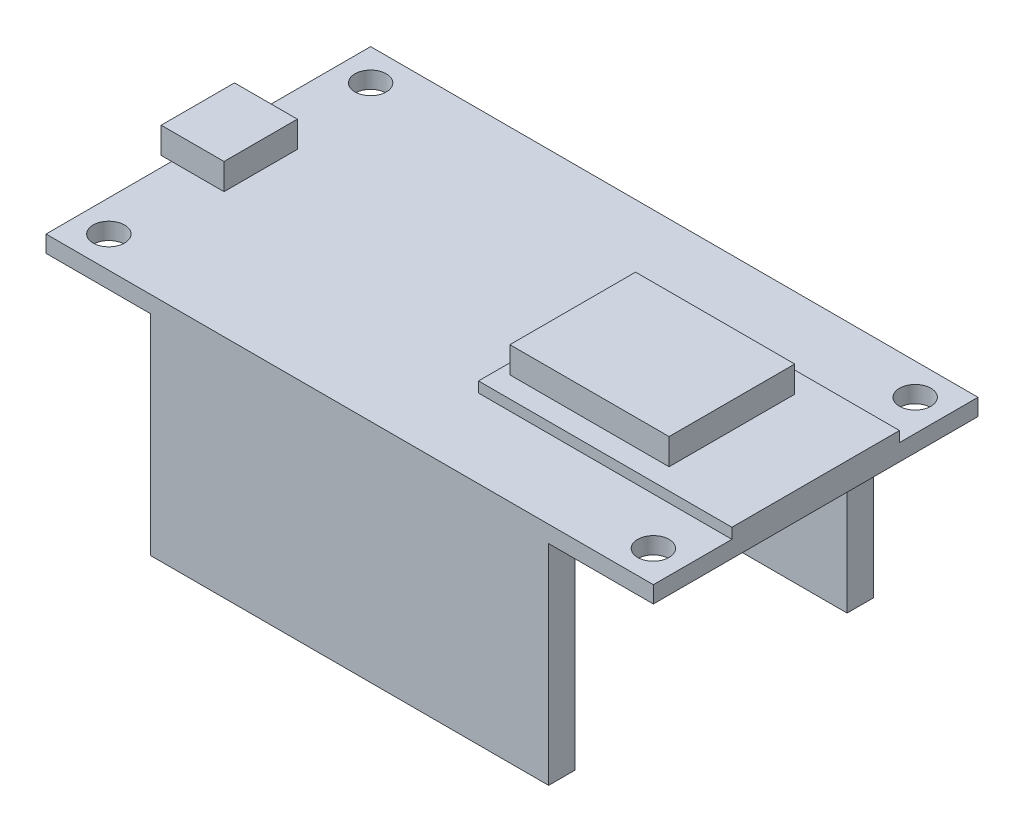
ISO-10303-21;
HEADER;
FILE_DESCRIPTION(('STEP AP214'),'2;1');
FILE_NAME('part.step','',(''),(''),'','','');
FILE_SCHEMA(('AUTOMOTIVE_DESIGN { 1 0 10303 214 1 1 1 1 }'));
ENDSEC;
DATA;
#1=APPLICATION_CONTEXT('core data for automotive mechanical design processes');
#2=APPLICATION_PROTOCOL_DEFINITION('international standard','automotive_design',2000,#1);
#3=PRODUCT_CONTEXT('',#1,'mechanical');
#4=PRODUCT('Part','Part','',(#3));
#5=PRODUCT_RELATED_PRODUCT_CATEGORY('part','',(#4));
#6=PRODUCT_DEFINITION_FORMATION('','',#4);
#7=PRODUCT_DEFINITION_CONTEXT('part definition',#1,'design');
#8=PRODUCT_DEFINITION('design','',#6,#7);
#9=PRODUCT_DEFINITION_SHAPE('','',#8);
#10=(LENGTH_UNIT() NAMED_UNIT(*) SI_UNIT(.MILLI.,.METRE.));
#11=(NAMED_UNIT(*) PLANE_ANGLE_UNIT() SI_UNIT($,.RADIAN.));
#12=(NAMED_UNIT(*) SI_UNIT($,.STERADIAN.) SOLID_ANGLE_UNIT());
#13=UNCERTAINTY_MEASURE_WITH_UNIT(LENGTH_MEASURE(1.E-05),#10,'distance_accuracy_value','');
#14=(GEOMETRIC_REPRESENTATION_CONTEXT(3) GLOBAL_UNCERTAINTY_ASSIGNED_CONTEXT((#13)) GLOBAL_UNIT_ASSIGNED_CONTEXT((#10,
#11,#12)) REPRESENTATION_CONTEXT('',''));
#15=CARTESIAN_POINT('',(0.,0.,0.));
#16=DIRECTION('',(0.,0.,1.));
#17=DIRECTION('',(1.,0.,0.));
#18=AXIS2_PLACEMENT_3D('',#15,#16,#17);
#19=CARTESIAN_POINT('',(0.,0.,0.));
#20=DIRECTION('',(0.,-1.,0.));
#21=DIRECTION('',(0.,0.,-1.));
#22=AXIS2_PLACEMENT_3D('',#19,#20,#21);
#23=PLANE('',#22);
#24=CARTESIAN_POINT('',(-26.,0.,12.5));
#25=DIRECTION('',(0.,1.,0.));
#26=DIRECTION('',(0.,0.,1.));
#27=AXIS2_PLACEMENT_3D('',#24,#25,#26);
#28=CIRCLE('',#27,1.5);
#29=CARTESIAN_POINT('',(-26.,0.,14.));
#30=VERTEX_POINT('',#29);
#31=EDGE_CURVE('E277',#30,#30,#28,.T.);
#32=ORIENTED_EDGE('',*,*,#31,.T.);
#33=EDGE_LOOP('',(#32));
#34=FACE_BOUND('',#33,.T.);
#35=CARTESIAN_POINT('',(26.,0.,-12.5));
#36=DIRECTION('',(0.,1.,0.));
#37=DIRECTION('',(0.,0.,1.));
#38=AXIS2_PLACEMENT_3D('',#35,#36,#37);
#39=CIRCLE('',#38,1.5);
#40=CARTESIAN_POINT('',(26.,0.,-11.));
#41=VERTEX_POINT('',#40);
#42=EDGE_CURVE('E284',#41,#41,#39,.T.);
#43=ORIENTED_EDGE('',*,*,#42,.T.);
#44=EDGE_LOOP('',(#43));
#45=FACE_BOUND('',#44,.T.);
#46=CARTESIAN_POINT('',(26.,0.,12.5));
#47=DIRECTION('',(0.,1.,0.));
#48=DIRECTION('',(0.,0.,1.));
#49=AXIS2_PLACEMENT_3D('',#46,#47,#48);
#50=CIRCLE('',#49,1.5);
#51=CARTESIAN_POINT('',(26.,0.,14.));
#52=VERTEX_POINT('',#51);
#53=EDGE_CURVE('E290',#52,#52,#50,.T.);
#54=ORIENTED_EDGE('',*,*,#53,.T.);
#55=EDGE_LOOP('',(#54));
#56=FACE_BOUND('',#55,.T.);
#57=CARTESIAN_POINT('',(-26.,0.,-12.5));
#58=DIRECTION('',(0.,1.,0.));
#59=DIRECTION('',(0.,0.,1.));
#60=AXIS2_PLACEMENT_3D('',#57,#58,#59);
#61=CIRCLE('',#60,1.5);
#62=CARTESIAN_POINT('',(-26.,0.,-11.));
#63=VERTEX_POINT('',#62);
#64=EDGE_CURVE('E295',#63,#63,#61,.T.);
#65=ORIENTED_EDGE('',*,*,#64,.T.);
#66=EDGE_LOOP('',(#65));
#67=FACE_BOUND('',#66,.T.);
#68=DIRECTION('',(-1.,0.,0.));
#69=VECTOR('',#68,1.);
#70=CARTESIAN_POINT('',(-29.,0.,-15.5));
#71=LINE('',#70,#69);
#72=CARTESIAN_POINT('',(-19.,0.,-15.5));
#73=VERTEX_POINT('',#72);
#74=CARTESIAN_POINT('',(-29.,0.,-15.5));
#75=VERTEX_POINT('',#74);
#76=EDGE_CURVE('E399',#73,#75,#71,.T.);
#77=ORIENTED_EDGE('',*,*,#76,.F.);
#78=DIRECTION('',(0.,0.,-1.));
#79=VECTOR('',#78,1.);
#80=CARTESIAN_POINT('',(-19.,0.,-15.5));
#81=LINE('',#80,#79);
#82=CARTESIAN_POINT('',(-19.,0.,-13.));
#83=VERTEX_POINT('',#82);
#84=EDGE_CURVE('E223',#83,#73,#81,.T.);
#85=ORIENTED_EDGE('',*,*,#84,.F.);
#86=DIRECTION('',(-1.,0.,0.));
#87=VECTOR('',#86,1.);
#88=CARTESIAN_POINT('',(-19.,0.,-13.));
#89=LINE('',#88,#87);
#90=CARTESIAN_POINT('',(19.,0.,-13.));
#91=VERTEX_POINT('',#90);
#92=EDGE_CURVE('E219',#91,#83,#89,.T.);
#93=ORIENTED_EDGE('',*,*,#92,.F.);
#94=DIRECTION('',(0.,0.,1.));
#95=VECTOR('',#94,1.);
#96=CARTESIAN_POINT('',(19.,0.,-15.5));
#97=LINE('',#96,#95);
#98=CARTESIAN_POINT('',(19.,0.,-15.5));
#99=VERTEX_POINT('',#98);
#100=EDGE_CURVE('E480',#99,#91,#97,.T.);
#101=ORIENTED_EDGE('',*,*,#100,.F.);
#102=CARTESIAN_POINT('',(29.,0.,-15.5));
#103=VERTEX_POINT('',#102);
#104=EDGE_CURVE('E400',#103,#99,#71,.T.);
#105=ORIENTED_EDGE('',*,*,#104,.F.);
#106=DIRECTION('',(0.,0.,-1.));
#107=VECTOR('',#106,1.);
#108=CARTESIAN_POINT('',(29.,0.,15.5));
#109=LINE('',#108,#107);
#110=CARTESIAN_POINT('',(29.,0.,15.5));
#111=VERTEX_POINT('',#110);
#112=EDGE_CURVE('E384',#111,#103,#109,.T.);
#113=ORIENTED_EDGE('',*,*,#112,.F.);
#114=DIRECTION('',(1.,0.,0.));
#115=VECTOR('',#114,1.);
#116=CARTESIAN_POINT('',(-29.,0.,15.5));
#117=LINE('',#116,#115);
#118=CARTESIAN_POINT('',(19.,0.,15.5));
#119=VERTEX_POINT('',#118);
#120=EDGE_CURVE('E404',#119,#111,#117,.T.);
#121=ORIENTED_EDGE('',*,*,#120,.F.);
#122=DIRECTION('',(0.,0.,1.));
#123=VECTOR('',#122,1.);
#124=CARTESIAN_POINT('',(19.,0.,15.5));
#125=LINE('',#124,#123);
#126=CARTESIAN_POINT('',(19.,0.,13.));
#127=VERTEX_POINT('',#126);
#128=EDGE_CURVE('E236',#127,#119,#125,.T.);
#129=ORIENTED_EDGE('',*,*,#128,.F.);
#130=DIRECTION('',(1.,0.,0.));
#131=VECTOR('',#130,1.);
#132=CARTESIAN_POINT('',(-19.,0.,13.));
#133=LINE('',#132,#131);
#134=CARTESIAN_POINT('',(-19.,0.,13.));
#135=VERTEX_POINT('',#134);
#136=EDGE_CURVE('E56',#135,#127,#133,.T.);
#137=ORIENTED_EDGE('',*,*,#136,.F.);
#138=DIRECTION('',(0.,0.,-1.));
#139=VECTOR('',#138,1.);
#140=CARTESIAN_POINT('',(-19.,0.,15.5));
#141=LINE('',#140,#139);
#142=CARTESIAN_POINT('',(-19.,0.,15.5));
#143=VERTEX_POINT('',#142);
#144=EDGE_CURVE('E225',#143,#135,#141,.T.);
#145=ORIENTED_EDGE('',*,*,#144,.F.);
#146=CARTESIAN_POINT('',(-29.,0.,15.5));
#147=VERTEX_POINT('',#146);
#148=EDGE_CURVE('E405',#147,#143,#117,.T.);
#149=ORIENTED_EDGE('',*,*,#148,.F.);
#150=DIRECTION('',(0.,0.,1.));
#151=VECTOR('',#150,1.);
#152=CARTESIAN_POINT('',(-29.,0.,15.5));
#153=LINE('',#152,#151);
#154=EDGE_CURVE('E402',#75,#147,#153,.T.);
#155=ORIENTED_EDGE('',*,*,#154,.F.);
#156=EDGE_LOOP('',(#77,#85,#93,#101,#105,#113,#121,#129,#137,#145,#149,#155));
#157=FACE_BOUND('',#156,.T.);
#158=ADVANCED_FACE('F33',(#34,#45,#56,#67,#157),#23,.T.);
#159=CARTESIAN_POINT('',(-29.,1.6,15.5));
#160=DIRECTION('',(1.,0.,0.));
#161=DIRECTION('',(0.,0.,-1.));
#162=AXIS2_PLACEMENT_3D('',#159,#160,#161);
#163=PLANE('',#162);
#164=DIRECTION('',(0.,0.,1.));
#165=VECTOR('',#164,1.);
#166=CARTESIAN_POINT('',(-29.,1.6,-3.5));
#167=LINE('',#166,#165);
#168=CARTESIAN_POINT('',(-29.,1.6,-3.5));
#169=VERTEX_POINT('',#168);
#170=CARTESIAN_POINT('',(-29.,1.6,3.5));
#171=VERTEX_POINT('',#170);
#172=EDGE_CURVE('E256',#169,#171,#167,.T.);
#173=ORIENTED_EDGE('',*,*,#172,.F.);
#174=DIRECTION('',(0.,0.,1.));
#175=VECTOR('',#174,1.);
#176=CARTESIAN_POINT('',(-29.,1.6,15.5));
#177=LINE('',#176,#175);
#178=CARTESIAN_POINT('',(-29.,1.6,-15.5));
#179=VERTEX_POINT('',#178);
#180=EDGE_CURVE('E391',#179,#169,#177,.T.);
#181=ORIENTED_EDGE('',*,*,#180,.F.);
#182=DIRECTION('',(0.,-1.,0.));
#183=VECTOR('',#182,1.);
#184=CARTESIAN_POINT('',(-29.,1.6,-15.5));
#185=LINE('',#184,#183);
#186=EDGE_CURVE('E41',#179,#75,#185,.T.);
#187=ORIENTED_EDGE('',*,*,#186,.T.);
#188=ORIENTED_EDGE('',*,*,#154,.T.);
#189=DIRECTION('',(0.,-1.,0.));
#190=VECTOR('',#189,1.);
#191=CARTESIAN_POINT('',(-29.,1.6,15.5));
#192=LINE('',#191,#190);
#193=CARTESIAN_POINT('',(-29.,1.6,15.5));
#194=VERTEX_POINT('',#193);
#195=EDGE_CURVE('E410',#194,#147,#192,.T.);
#196=ORIENTED_EDGE('',*,*,#195,.F.);
#197=EDGE_CURVE('E390',#171,#194,#177,.T.);
#198=ORIENTED_EDGE('',*,*,#197,.F.);
#199=EDGE_LOOP('',(#173,#181,#187,#188,#196,#198));
#200=FACE_BOUND('',#199,.T.);
#201=ADVANCED_FACE('F417',(#200),#163,.F.);
#202=CARTESIAN_POINT('',(0.,1.6,0.));
#203=DIRECTION('',(0.,-1.,0.));
#204=DIRECTION('',(0.,0.,-1.));
#205=AXIS2_PLACEMENT_3D('',#202,#203,#204);
#206=PLANE('',#205);
#207=CARTESIAN_POINT('',(-26.,1.6,12.5));
#208=DIRECTION('',(0.,1.,0.));
#209=DIRECTION('',(0.,0.,1.));
#210=AXIS2_PLACEMENT_3D('',#207,#208,#209);
#211=CIRCLE('',#210,1.5);
#212=CARTESIAN_POINT('',(-26.,1.6,14.));
#213=VERTEX_POINT('',#212);
#214=EDGE_CURVE('E281',#213,#213,#211,.T.);
#215=ORIENTED_EDGE('',*,*,#214,.F.);
#216=EDGE_LOOP('',(#215));
#217=FACE_BOUND('',#216,.T.);
#218=CARTESIAN_POINT('',(26.,1.6,-12.5));
#219=DIRECTION('',(0.,1.,0.));
#220=DIRECTION('',(0.,0.,1.));
#221=AXIS2_PLACEMENT_3D('',#218,#219,#220);
#222=CIRCLE('',#221,1.5);
#223=CARTESIAN_POINT('',(26.,1.6,-11.));
#224=VERTEX_POINT('',#223);
#225=EDGE_CURVE('E287',#224,#224,#222,.T.);
#226=ORIENTED_EDGE('',*,*,#225,.F.);
#227=EDGE_LOOP('',(#226));
#228=FACE_BOUND('',#227,.T.);
#229=CARTESIAN_POINT('',(26.,1.6,12.5));
#230=DIRECTION('',(0.,1.,0.));
#231=DIRECTION('',(0.,0.,1.));
#232=AXIS2_PLACEMENT_3D('',#229,#230,#231);
#233=CIRCLE('',#232,1.5);
#234=CARTESIAN_POINT('',(26.,1.6,14.));
#235=VERTEX_POINT('',#234);
#236=EDGE_CURVE('E276',#235,#235,#233,.T.);
#237=ORIENTED_EDGE('',*,*,#236,.F.);
#238=EDGE_LOOP('',(#237));
#239=FACE_BOUND('',#238,.T.);
#240=CARTESIAN_POINT('',(-26.,1.6,-12.5));
#241=DIRECTION('',(0.,1.,0.));
#242=DIRECTION('',(0.,0.,1.));
#243=AXIS2_PLACEMENT_3D('',#240,#241,#242);
#244=CIRCLE('',#243,1.5);
#245=CARTESIAN_POINT('',(-26.,1.6,-11.));
#246=VERTEX_POINT('',#245);
#247=EDGE_CURVE('E280',#246,#246,#244,.T.);
#248=ORIENTED_EDGE('',*,*,#247,.F.);
#249=EDGE_LOOP('',(#248));
#250=FACE_BOUND('',#249,.T.);
#251=DIRECTION('',(1.,0.,0.));
#252=VECTOR('',#251,1.);
#253=CARTESIAN_POINT('',(-29.,1.6,3.5));
#254=LINE('',#253,#252);
#255=CARTESIAN_POINT('',(-24.,1.6,3.5));
#256=VERTEX_POINT('',#255);
#257=EDGE_CURVE('E298',#171,#256,#254,.T.);
#258=ORIENTED_EDGE('',*,*,#257,.F.);
#259=ORIENTED_EDGE('',*,*,#197,.T.);
#260=DIRECTION('',(1.,0.,0.));
#261=VECTOR('',#260,1.);
#262=CARTESIAN_POINT('',(-29.,1.6,15.5));
#263=LINE('',#262,#261);
#264=CARTESIAN_POINT('',(29.,1.6,15.5));
#265=VERTEX_POINT('',#264);
#266=EDGE_CURVE('E394',#194,#265,#263,.T.);
#267=ORIENTED_EDGE('',*,*,#266,.T.);
#268=DIRECTION('',(0.,0.,-1.));
#269=VECTOR('',#268,1.);
#270=CARTESIAN_POINT('',(29.,1.6,15.5));
#271=LINE('',#270,#269);
#272=CARTESIAN_POINT('',(29.,1.6,8.));
#273=VERTEX_POINT('',#272);
#274=EDGE_CURVE('E385',#265,#273,#271,.T.);
#275=ORIENTED_EDGE('',*,*,#274,.T.);
#276=DIRECTION('',(1.,0.,0.));
#277=VECTOR('',#276,1.);
#278=CARTESIAN_POINT('',(29.,1.6,8.));
#279=LINE('',#278,#277);
#280=CARTESIAN_POINT('',(4.80000000000001,1.6,8.));
#281=VERTEX_POINT('',#280);
#282=EDGE_CURVE('E359',#281,#273,#279,.T.);
#283=ORIENTED_EDGE('',*,*,#282,.F.);
#284=DIRECTION('',(0.,0.,1.));
#285=VECTOR('',#284,1.);
#286=CARTESIAN_POINT('',(4.80000000000001,1.6,-8.));
#287=LINE('',#286,#285);
#288=CARTESIAN_POINT('',(4.80000000000001,1.6,-8.));
#289=VERTEX_POINT('',#288);
#290=EDGE_CURVE('E368',#289,#281,#287,.T.);
#291=ORIENTED_EDGE('',*,*,#290,.F.);
#292=DIRECTION('',(-1.,0.,0.));
#293=VECTOR('',#292,1.);
#294=CARTESIAN_POINT('',(29.,1.6,-8.));
#295=LINE('',#294,#293);
#296=CARTESIAN_POINT('',(29.,1.6,-8.));
#297=VERTEX_POINT('',#296);
#298=EDGE_CURVE('E354',#297,#289,#295,.T.);
#299=ORIENTED_EDGE('',*,*,#298,.F.);
#300=CARTESIAN_POINT('',(29.,1.6,-15.5));
#301=VERTEX_POINT('',#300);
#302=EDGE_CURVE('E388',#297,#301,#271,.T.);
#303=ORIENTED_EDGE('',*,*,#302,.T.);
#304=DIRECTION('',(-1.,0.,0.));
#305=VECTOR('',#304,1.);
#306=CARTESIAN_POINT('',(-29.,1.6,-15.5));
#307=LINE('',#306,#305);
#308=EDGE_CURVE('E387',#301,#179,#307,.T.);
#309=ORIENTED_EDGE('',*,*,#308,.T.);
#310=ORIENTED_EDGE('',*,*,#180,.T.);
#311=DIRECTION('',(-1.,0.,0.));
#312=VECTOR('',#311,1.);
#313=CARTESIAN_POINT('',(-29.,1.6,-3.5));
#314=LINE('',#313,#312);
#315=CARTESIAN_POINT('',(-24.,1.6,-3.5));
#316=VERTEX_POINT('',#315);
#317=EDGE_CURVE('E304',#316,#169,#314,.T.);
#318=ORIENTED_EDGE('',*,*,#317,.F.);
#319=DIRECTION('',(0.,0.,-1.));
#320=VECTOR('',#319,1.);
#321=CARTESIAN_POINT('',(-24.,1.6,-3.5));
#322=LINE('',#321,#320);
#323=EDGE_CURVE('E311',#256,#316,#322,.T.);
#324=ORIENTED_EDGE('',*,*,#323,.F.);
#325=EDGE_LOOP('',(#258,#259,#267,#275,#283,#291,#299,#303,#309,#310,#318,#324));
#326=FACE_BOUND('',#325,.T.);
#327=ADVANCED_FACE('F456',(#217,#228,#239,#250,#326),#206,.F.);
#328=CARTESIAN_POINT('',(0.,2.6,0.));
#329=DIRECTION('',(0.,-1.,0.));
#330=DIRECTION('',(0.,0.,-1.));
#331=AXIS2_PLACEMENT_3D('',#328,#329,#330);
#332=PLANE('',#331);
#333=DIRECTION('',(0.,0.,-1.));
#334=VECTOR('',#333,1.);
#335=CARTESIAN_POINT('',(29.,2.6,-8.));
#336=LINE('',#335,#334);
#337=CARTESIAN_POINT('',(29.,2.6,8.));
#338=VERTEX_POINT('',#337);
#339=CARTESIAN_POINT('',(29.,2.6,-8.));
#340=VERTEX_POINT('',#339);
#341=EDGE_CURVE('E355',#338,#340,#336,.T.);
#342=ORIENTED_EDGE('',*,*,#341,.T.);
#343=DIRECTION('',(-1.,0.,0.));
#344=VECTOR('',#343,1.);
#345=CARTESIAN_POINT('',(29.,2.6,-8.));
#346=LINE('',#345,#344);
#347=CARTESIAN_POINT('',(4.80000000000001,2.6,-8.));
#348=VERTEX_POINT('',#347);
#349=EDGE_CURVE('E358',#340,#348,#346,.T.);
#350=ORIENTED_EDGE('',*,*,#349,.T.);
#351=DIRECTION('',(0.,0.,1.));
#352=VECTOR('',#351,1.);
#353=CARTESIAN_POINT('',(4.80000000000001,2.6,-8.));
#354=LINE('',#353,#352);
#355=CARTESIAN_POINT('',(4.80000000000001,2.6,8.));
#356=VERTEX_POINT('',#355);
#357=EDGE_CURVE('E361',#348,#356,#354,.T.);
#358=ORIENTED_EDGE('',*,*,#357,.T.);
#359=DIRECTION('',(1.,0.,0.));
#360=VECTOR('',#359,1.);
#361=CARTESIAN_POINT('',(29.,2.6,8.));
#362=LINE('',#361,#360);
#363=EDGE_CURVE('E363',#356,#338,#362,.T.);
#364=ORIENTED_EDGE('',*,*,#363,.T.);
#365=EDGE_LOOP('',(#342,#350,#358,#364));
#366=FACE_BOUND('',#365,.T.);
#367=DIRECTION('',(0.,0.,1.));
#368=VECTOR('',#367,1.);
#369=CARTESIAN_POINT('',(5.80000000000001,2.6,-6.));
#370=LINE('',#369,#368);
#371=CARTESIAN_POINT('',(5.80000000000001,2.6,-6.));
#372=VERTEX_POINT('',#371);
#373=CARTESIAN_POINT('',(5.80000000000001,2.6,6.));
#374=VERTEX_POINT('',#373);
#375=EDGE_CURVE('E321',#372,#374,#370,.T.);
#376=ORIENTED_EDGE('',*,*,#375,.F.);
#377=DIRECTION('',(-1.,0.,0.));
#378=VECTOR('',#377,1.);
#379=CARTESIAN_POINT('',(5.80000000000001,2.6,-6.));
#380=LINE('',#379,#378);
#381=CARTESIAN_POINT('',(21.,2.6,-6.));
#382=VERTEX_POINT('',#381);
#383=EDGE_CURVE('E326',#382,#372,#380,.T.);
#384=ORIENTED_EDGE('',*,*,#383,.F.);
#385=DIRECTION('',(0.,0.,-1.));
#386=VECTOR('',#385,1.);
#387=CARTESIAN_POINT('',(21.,2.6,-6.));
#388=LINE('',#387,#386);
#389=CARTESIAN_POINT('',(21.,2.6,6.));
#390=VERTEX_POINT('',#389);
#391=EDGE_CURVE('E338',#390,#382,#388,.T.);
#392=ORIENTED_EDGE('',*,*,#391,.F.);
#393=DIRECTION('',(1.,0.,0.));
#394=VECTOR('',#393,1.);
#395=CARTESIAN_POINT('',(5.80000000000001,2.6,6.));
#396=LINE('',#395,#394);
#397=EDGE_CURVE('E335',#374,#390,#396,.T.);
#398=ORIENTED_EDGE('',*,*,#397,.F.);
#399=EDGE_LOOP('',(#376,#384,#392,#398));
#400=FACE_BOUND('',#399,.T.);
#401=ADVANCED_FACE('F468',(#366,#400),#332,.F.);
#402=CARTESIAN_POINT('',(29.,1.6,15.5));
#403=DIRECTION('',(-1.,0.,0.));
#404=DIRECTION('',(0.,0.,1.));
#405=AXIS2_PLACEMENT_3D('',#402,#403,#404);
#406=PLANE('',#405);
#407=ORIENTED_EDGE('',*,*,#112,.T.);
#408=DIRECTION('',(0.,-1.,0.));
#409=VECTOR('',#408,1.);
#410=CARTESIAN_POINT('',(29.,1.6,-15.5));
#411=LINE('',#410,#409);
#412=EDGE_CURVE('E11',#301,#103,#411,.T.);
#413=ORIENTED_EDGE('',*,*,#412,.F.);
#414=ORIENTED_EDGE('',*,*,#302,.F.);
#415=DIRECTION('',(0.,-1.,0.));
#416=VECTOR('',#415,1.);
#417=CARTESIAN_POINT('',(29.,2.6,-8.));
#418=LINE('',#417,#416);
#419=EDGE_CURVE('E381',#340,#297,#418,.T.);
#420=ORIENTED_EDGE('',*,*,#419,.F.);
#421=ORIENTED_EDGE('',*,*,#341,.F.);
#422=DIRECTION('',(0.,-1.,0.));
#423=VECTOR('',#422,1.);
#424=CARTESIAN_POINT('',(29.,2.6,8.));
#425=LINE('',#424,#423);
#426=EDGE_CURVE('E365',#338,#273,#425,.T.);
#427=ORIENTED_EDGE('',*,*,#426,.T.);
#428=ORIENTED_EDGE('',*,*,#274,.F.);
#429=DIRECTION('',(0.,-1.,0.));
#430=VECTOR('',#429,1.);
#431=CARTESIAN_POINT('',(29.,1.6,15.5));
#432=LINE('',#431,#430);
#433=EDGE_CURVE('E396',#265,#111,#432,.T.);
#434=ORIENTED_EDGE('',*,*,#433,.T.);
#435=EDGE_LOOP('',(#407,#413,#414,#420,#421,#427,#428,#434));
#436=FACE_BOUND('',#435,.T.);
#437=ADVANCED_FACE('F35',(#436),#406,.F.);
#438=CARTESIAN_POINT('',(-29.,1.6,-15.5));
#439=DIRECTION('',(0.,0.,1.));
#440=DIRECTION('',(1.,0.,0.));
#441=AXIS2_PLACEMENT_3D('',#438,#439,#440);
#442=PLANE('',#441);
#443=ORIENTED_EDGE('',*,*,#104,.T.);
#444=DIRECTION('',(0.,1.,0.));
#445=VECTOR('',#444,1.);
#446=CARTESIAN_POINT('',(19.,-20.,-15.5));
#447=LINE('',#446,#445);
#448=CARTESIAN_POINT('',(19.,-20.,-15.5));
#449=VERTEX_POINT('',#448);
#450=EDGE_CURVE('E207',#449,#99,#447,.T.);
#451=ORIENTED_EDGE('',*,*,#450,.F.);
#452=DIRECTION('',(1.,0.,0.));
#453=VECTOR('',#452,1.);
#454=CARTESIAN_POINT('',(-19.,-20.,-15.5));
#455=LINE('',#454,#453);
#456=CARTESIAN_POINT('',(-19.,-20.,-15.5));
#457=VERTEX_POINT('',#456);
#458=EDGE_CURVE('E200',#457,#449,#455,.T.);
#459=ORIENTED_EDGE('',*,*,#458,.F.);
#460=DIRECTION('',(0.,1.,0.));
#461=VECTOR('',#460,1.);
#462=CARTESIAN_POINT('',(-19.,-20.,-15.5));
#463=LINE('',#462,#461);
#464=EDGE_CURVE('E205',#457,#73,#463,.T.);
#465=ORIENTED_EDGE('',*,*,#464,.T.);
#466=ORIENTED_EDGE('',*,*,#76,.T.);
#467=ORIENTED_EDGE('',*,*,#186,.F.);
#468=ORIENTED_EDGE('',*,*,#308,.F.);
#469=ORIENTED_EDGE('',*,*,#412,.T.);
#470=EDGE_LOOP('',(#443,#451,#459,#465,#466,#467,#468,#469));
#471=FACE_BOUND('',#470,.T.);
#472=ADVANCED_FACE('F203',(#471),#442,.F.);
#473=CARTESIAN_POINT('',(-29.,1.6,15.5));
#474=DIRECTION('',(0.,0.,-1.));
#475=DIRECTION('',(-1.,0.,0.));
#476=AXIS2_PLACEMENT_3D('',#473,#474,#475);
#477=PLANE('',#476);
#478=ORIENTED_EDGE('',*,*,#148,.T.);
#479=DIRECTION('',(0.,1.,0.));
#480=VECTOR('',#479,1.);
#481=CARTESIAN_POINT('',(-19.,-20.,15.5));
#482=LINE('',#481,#480);
#483=CARTESIAN_POINT('',(-19.,-20.,15.5));
#484=VERTEX_POINT('',#483);
#485=EDGE_CURVE('E241',#484,#143,#482,.T.);
#486=ORIENTED_EDGE('',*,*,#485,.F.);
#487=DIRECTION('',(-1.,0.,0.));
#488=VECTOR('',#487,1.);
#489=CARTESIAN_POINT('',(-19.,-20.,15.5));
#490=LINE('',#489,#488);
#491=CARTESIAN_POINT('',(19.,-20.,15.5));
#492=VERTEX_POINT('',#491);
#493=EDGE_CURVE('E240',#492,#484,#490,.T.);
#494=ORIENTED_EDGE('',*,*,#493,.F.);
#495=DIRECTION('',(0.,1.,0.));
#496=VECTOR('',#495,1.);
#497=CARTESIAN_POINT('',(19.,-20.,15.5));
#498=LINE('',#497,#496);
#499=EDGE_CURVE('E248',#492,#119,#498,.T.);
#500=ORIENTED_EDGE('',*,*,#499,.T.);
#501=ORIENTED_EDGE('',*,*,#120,.T.);
#502=ORIENTED_EDGE('',*,*,#433,.F.);
#503=ORIENTED_EDGE('',*,*,#266,.F.);
#504=ORIENTED_EDGE('',*,*,#195,.T.);
#505=EDGE_LOOP('',(#478,#486,#494,#500,#501,#502,#503,#504));
#506=FACE_BOUND('',#505,.T.);
#507=ADVANCED_FACE('F423',(#506),#477,.F.);
#508=CARTESIAN_POINT('',(29.,2.6,-8.));
#509=DIRECTION('',(0.,0.,1.));
#510=DIRECTION('',(1.,0.,0.));
#511=AXIS2_PLACEMENT_3D('',#508,#509,#510);
#512=PLANE('',#511);
#513=ORIENTED_EDGE('',*,*,#298,.T.);
#514=DIRECTION('',(0.,-1.,0.));
#515=VECTOR('',#514,1.);
#516=CARTESIAN_POINT('',(4.80000000000001,2.6,-8.));
#517=LINE('',#516,#515);
#518=EDGE_CURVE('E378',#348,#289,#517,.T.);
#519=ORIENTED_EDGE('',*,*,#518,.F.);
#520=ORIENTED_EDGE('',*,*,#349,.F.);
#521=ORIENTED_EDGE('',*,*,#419,.T.);
#522=EDGE_LOOP('',(#513,#519,#520,#521));
#523=FACE_BOUND('',#522,.T.);
#524=ADVANCED_FACE('F463',(#523),#512,.F.);
#525=CARTESIAN_POINT('',(4.80000000000001,2.6,-8.));
#526=DIRECTION('',(1.,0.,0.));
#527=DIRECTION('',(0.,0.,-1.));
#528=AXIS2_PLACEMENT_3D('',#525,#526,#527);
#529=PLANE('',#528);
#530=ORIENTED_EDGE('',*,*,#290,.T.);
#531=DIRECTION('',(0.,-1.,0.));
#532=VECTOR('',#531,1.);
#533=CARTESIAN_POINT('',(4.80000000000001,2.6,8.));
#534=LINE('',#533,#532);
#535=EDGE_CURVE('E375',#356,#281,#534,.T.);
#536=ORIENTED_EDGE('',*,*,#535,.F.);
#537=ORIENTED_EDGE('',*,*,#357,.F.);
#538=ORIENTED_EDGE('',*,*,#518,.T.);
#539=EDGE_LOOP('',(#530,#536,#537,#538));
#540=FACE_BOUND('',#539,.T.);
#541=ADVANCED_FACE('F494',(#540),#529,.F.);
#542=CARTESIAN_POINT('',(29.,2.6,8.));
#543=DIRECTION('',(0.,0.,-1.));
#544=DIRECTION('',(-1.,0.,0.));
#545=AXIS2_PLACEMENT_3D('',#542,#543,#544);
#546=PLANE('',#545);
#547=ORIENTED_EDGE('',*,*,#282,.T.);
#548=ORIENTED_EDGE('',*,*,#426,.F.);
#549=ORIENTED_EDGE('',*,*,#363,.F.);
#550=ORIENTED_EDGE('',*,*,#535,.T.);
#551=EDGE_LOOP('',(#547,#548,#549,#550));
#552=FACE_BOUND('',#551,.T.);
#553=ADVANCED_FACE('F491',(#552),#546,.F.);
#554=CARTESIAN_POINT('',(5.80000000000001,5.1,-6.));
#555=DIRECTION('',(1.,0.,0.));
#556=DIRECTION('',(0.,0.,-1.));
#557=AXIS2_PLACEMENT_3D('',#554,#555,#556);
#558=PLANE('',#557);
#559=ORIENTED_EDGE('',*,*,#375,.T.);
#560=DIRECTION('',(0.,-1.,0.));
#561=VECTOR('',#560,1.);
#562=CARTESIAN_POINT('',(5.80000000000001,5.1,6.));
#563=LINE('',#562,#561);
#564=CARTESIAN_POINT('',(5.80000000000001,5.1,6.));
#565=VERTEX_POINT('',#564);
#566=EDGE_CURVE('E351',#565,#374,#563,.T.);
#567=ORIENTED_EDGE('',*,*,#566,.F.);
#568=DIRECTION('',(0.,0.,1.));
#569=VECTOR('',#568,1.);
#570=CARTESIAN_POINT('',(5.80000000000001,5.1,-6.));
#571=LINE('',#570,#569);
#572=CARTESIAN_POINT('',(5.80000000000001,5.1,-6.));
#573=VERTEX_POINT('',#572);
#574=EDGE_CURVE('E322',#573,#565,#571,.T.);
#575=ORIENTED_EDGE('',*,*,#574,.F.);
#576=DIRECTION('',(0.,-1.,0.));
#577=VECTOR('',#576,1.);
#578=CARTESIAN_POINT('',(5.80000000000001,5.1,-6.));
#579=LINE('',#578,#577);
#580=EDGE_CURVE('E332',#573,#372,#579,.T.);
#581=ORIENTED_EDGE('',*,*,#580,.T.);
#582=EDGE_LOOP('',(#559,#567,#575,#581));
#583=FACE_BOUND('',#582,.T.);
#584=ADVANCED_FACE('F501',(#583),#558,.F.);
#585=CARTESIAN_POINT('',(5.80000000000001,5.1,6.));
#586=DIRECTION('',(0.,0.,-1.));
#587=DIRECTION('',(-1.,0.,0.));
#588=AXIS2_PLACEMENT_3D('',#585,#586,#587);
#589=PLANE('',#588);
#590=ORIENTED_EDGE('',*,*,#397,.T.);
#591=DIRECTION('',(0.,-1.,0.));
#592=VECTOR('',#591,1.);
#593=CARTESIAN_POINT('',(21.,5.1,6.));
#594=LINE('',#593,#592);
#595=CARTESIAN_POINT('',(21.,5.1,6.));
#596=VERTEX_POINT('',#595);
#597=EDGE_CURVE('E348',#596,#390,#594,.T.);
#598=ORIENTED_EDGE('',*,*,#597,.F.);
#599=DIRECTION('',(1.,0.,0.));
#600=VECTOR('',#599,1.);
#601=CARTESIAN_POINT('',(5.80000000000001,5.1,6.));
#602=LINE('',#601,#600);
#603=EDGE_CURVE('E325',#565,#596,#602,.T.);
#604=ORIENTED_EDGE('',*,*,#603,.F.);
#605=ORIENTED_EDGE('',*,*,#566,.T.);
#606=EDGE_LOOP('',(#590,#598,#604,#605));
#607=FACE_BOUND('',#606,.T.);
#608=ADVANCED_FACE('F506',(#607),#589,.F.);
#609=CARTESIAN_POINT('',(21.,5.1,-6.));
#610=DIRECTION('',(-1.,0.,0.));
#611=DIRECTION('',(0.,0.,1.));
#612=AXIS2_PLACEMENT_3D('',#609,#610,#611);
#613=PLANE('',#612);
#614=ORIENTED_EDGE('',*,*,#391,.T.);
#615=DIRECTION('',(0.,-1.,0.));
#616=VECTOR('',#615,1.);
#617=CARTESIAN_POINT('',(21.,5.1,-6.));
#618=LINE('',#617,#616);
#619=CARTESIAN_POINT('',(21.,5.1,-6.));
#620=VERTEX_POINT('',#619);
#621=EDGE_CURVE('E345',#620,#382,#618,.T.);
#622=ORIENTED_EDGE('',*,*,#621,.F.);
#623=DIRECTION('',(0.,0.,-1.));
#624=VECTOR('',#623,1.);
#625=CARTESIAN_POINT('',(21.,5.1,-6.));
#626=LINE('',#625,#624);
#627=EDGE_CURVE('E328',#596,#620,#626,.T.);
#628=ORIENTED_EDGE('',*,*,#627,.F.);
#629=ORIENTED_EDGE('',*,*,#597,.T.);
#630=EDGE_LOOP('',(#614,#622,#628,#629));
#631=FACE_BOUND('',#630,.T.);
#632=ADVANCED_FACE('F510',(#631),#613,.F.);
#633=CARTESIAN_POINT('',(5.80000000000001,5.1,-6.));
#634=DIRECTION('',(0.,0.,1.));
#635=DIRECTION('',(1.,0.,0.));
#636=AXIS2_PLACEMENT_3D('',#633,#634,#635);
#637=PLANE('',#636);
#638=ORIENTED_EDGE('',*,*,#383,.T.);
#639=ORIENTED_EDGE('',*,*,#580,.F.);
#640=DIRECTION('',(-1.,0.,0.));
#641=VECTOR('',#640,1.);
#642=CARTESIAN_POINT('',(5.80000000000001,5.1,-6.));
#643=LINE('',#642,#641);
#644=EDGE_CURVE('E330',#620,#573,#643,.T.);
#645=ORIENTED_EDGE('',*,*,#644,.F.);
#646=ORIENTED_EDGE('',*,*,#621,.T.);
#647=EDGE_LOOP('',(#638,#639,#645,#646));
#648=FACE_BOUND('',#647,.T.);
#649=ADVANCED_FACE('F514',(#648),#637,.F.);
#650=CARTESIAN_POINT('',(0.,5.1,0.));
#651=DIRECTION('',(0.,1.,0.));
#652=DIRECTION('',(0.,0.,1.));
#653=AXIS2_PLACEMENT_3D('',#650,#651,#652);
#654=PLANE('',#653);
#655=ORIENTED_EDGE('',*,*,#574,.T.);
#656=ORIENTED_EDGE('',*,*,#603,.T.);
#657=ORIENTED_EDGE('',*,*,#627,.T.);
#658=ORIENTED_EDGE('',*,*,#644,.T.);
#659=EDGE_LOOP('',(#655,#656,#657,#658));
#660=FACE_BOUND('',#659,.T.);
#661=ADVANCED_FACE('F518',(#660),#654,.T.);
#662=CARTESIAN_POINT('',(-29.,4.1,3.5));
#663=DIRECTION('',(0.,0.,-1.));
#664=DIRECTION('',(-1.,0.,0.));
#665=AXIS2_PLACEMENT_3D('',#662,#663,#664);
#666=PLANE('',#665);
#667=ORIENTED_EDGE('',*,*,#257,.T.);
#668=DIRECTION('',(0.,-1.,0.));
#669=VECTOR('',#668,1.);
#670=CARTESIAN_POINT('',(-24.,4.1,3.5));
#671=LINE('',#670,#669);
#672=CARTESIAN_POINT('',(-24.,4.1,3.5));
#673=VERTEX_POINT('',#672);
#674=EDGE_CURVE('E318',#673,#256,#671,.T.);
#675=ORIENTED_EDGE('',*,*,#674,.F.);
#676=DIRECTION('',(1.,0.,0.));
#677=VECTOR('',#676,1.);
#678=CARTESIAN_POINT('',(-29.,4.1,3.5));
#679=LINE('',#678,#677);
#680=CARTESIAN_POINT('',(-30.,4.1,3.5));
#681=VERTEX_POINT('',#680);
#682=EDGE_CURVE('E301',#681,#673,#679,.T.);
#683=ORIENTED_EDGE('',*,*,#682,.F.);
#684=DIRECTION('',(0.,1.,0.));
#685=VECTOR('',#684,1.);
#686=CARTESIAN_POINT('',(-30.,4.1,3.5));
#687=LINE('',#686,#685);
#688=CARTESIAN_POINT('',(-30.,1.6,3.5));
#689=VERTEX_POINT('',#688);
#690=EDGE_CURVE('E262',#689,#681,#687,.T.);
#691=ORIENTED_EDGE('',*,*,#690,.F.);
#692=DIRECTION('',(1.,0.,0.));
#693=VECTOR('',#692,1.);
#694=CARTESIAN_POINT('',(-30.,1.6,3.5));
#695=LINE('',#694,#693);
#696=EDGE_CURVE('E268',#689,#171,#695,.T.);
#697=ORIENTED_EDGE('',*,*,#696,.T.);
#698=EDGE_LOOP('',(#667,#675,#683,#691,#697));
#699=FACE_BOUND('',#698,.T.);
#700=ADVANCED_FACE('F522',(#699),#666,.F.);
#701=CARTESIAN_POINT('',(-24.,4.1,-3.5));
#702=DIRECTION('',(-1.,0.,0.));
#703=DIRECTION('',(0.,0.,1.));
#704=AXIS2_PLACEMENT_3D('',#701,#702,#703);
#705=PLANE('',#704);
#706=ORIENTED_EDGE('',*,*,#323,.T.);
#707=DIRECTION('',(0.,-1.,0.));
#708=VECTOR('',#707,1.);
#709=CARTESIAN_POINT('',(-24.,4.1,-3.5));
#710=LINE('',#709,#708);
#711=CARTESIAN_POINT('',(-24.,4.1,-3.5));
#712=VERTEX_POINT('',#711);
#713=EDGE_CURVE('E308',#712,#316,#710,.T.);
#714=ORIENTED_EDGE('',*,*,#713,.F.);
#715=DIRECTION('',(0.,0.,-1.));
#716=VECTOR('',#715,1.);
#717=CARTESIAN_POINT('',(-24.,4.1,-3.5));
#718=LINE('',#717,#716);
#719=EDGE_CURVE('E303',#673,#712,#718,.T.);
#720=ORIENTED_EDGE('',*,*,#719,.F.);
#721=ORIENTED_EDGE('',*,*,#674,.T.);
#722=EDGE_LOOP('',(#706,#714,#720,#721));
#723=FACE_BOUND('',#722,.T.);
#724=ADVANCED_FACE('F526',(#723),#705,.F.);
#725=CARTESIAN_POINT('',(-29.,4.1,-3.5));
#726=DIRECTION('',(0.,0.,1.));
#727=DIRECTION('',(1.,0.,0.));
#728=AXIS2_PLACEMENT_3D('',#725,#726,#727);
#729=PLANE('',#728);
#730=ORIENTED_EDGE('',*,*,#317,.T.);
#731=DIRECTION('',(1.,0.,0.));
#732=VECTOR('',#731,1.);
#733=CARTESIAN_POINT('',(-30.,1.6,-3.5));
#734=LINE('',#733,#732);
#735=CARTESIAN_POINT('',(-30.,1.6,-3.5));
#736=VERTEX_POINT('',#735);
#737=EDGE_CURVE('E273',#736,#169,#734,.T.);
#738=ORIENTED_EDGE('',*,*,#737,.F.);
#739=DIRECTION('',(0.,-1.,0.));
#740=VECTOR('',#739,1.);
#741=CARTESIAN_POINT('',(-30.,4.1,-3.5));
#742=LINE('',#741,#740);
#743=CARTESIAN_POINT('',(-30.,4.1,-3.5));
#744=VERTEX_POINT('',#743);
#745=EDGE_CURVE('E257',#744,#736,#742,.T.);
#746=ORIENTED_EDGE('',*,*,#745,.F.);
#747=DIRECTION('',(-1.,0.,0.));
#748=VECTOR('',#747,1.);
#749=CARTESIAN_POINT('',(-29.,4.1,-3.5));
#750=LINE('',#749,#748);
#751=EDGE_CURVE('E306',#712,#744,#750,.T.);
#752=ORIENTED_EDGE('',*,*,#751,.F.);
#753=ORIENTED_EDGE('',*,*,#713,.T.);
#754=EDGE_LOOP('',(#730,#738,#746,#752,#753));
#755=FACE_BOUND('',#754,.T.);
#756=ADVANCED_FACE('F530',(#755),#729,.F.);
#757=CARTESIAN_POINT('',(0.,4.1,0.));
#758=DIRECTION('',(0.,1.,0.));
#759=DIRECTION('',(0.,0.,1.));
#760=AXIS2_PLACEMENT_3D('',#757,#758,#759);
#761=PLANE('',#760);
#762=ORIENTED_EDGE('',*,*,#751,.T.);
#763=DIRECTION('',(0.,0.,-1.));
#764=VECTOR('',#763,1.);
#765=CARTESIAN_POINT('',(-30.,4.1,-3.5));
#766=LINE('',#765,#764);
#767=EDGE_CURVE('E265',#681,#744,#766,.T.);
#768=ORIENTED_EDGE('',*,*,#767,.F.);
#769=ORIENTED_EDGE('',*,*,#682,.T.);
#770=ORIENTED_EDGE('',*,*,#719,.T.);
#771=EDGE_LOOP('',(#762,#768,#769,#770));
#772=FACE_BOUND('',#771,.T.);
#773=ADVANCED_FACE('F534',(#772),#761,.T.);
#774=CARTESIAN_POINT('',(-26.,0.,-12.5));
#775=DIRECTION('',(0.,1.,0.));
#776=DIRECTION('',(0.,0.,1.));
#777=AXIS2_PLACEMENT_3D('',#774,#775,#776);
#778=CYLINDRICAL_SURFACE('',#777,1.5);
#779=ORIENTED_EDGE('',*,*,#64,.F.);
#780=EDGE_LOOP('',(#779));
#781=FACE_BOUND('',#780,.T.);
#782=ORIENTED_EDGE('',*,*,#247,.T.);
#783=EDGE_LOOP('',(#782));
#784=FACE_BOUND('',#783,.T.);
#785=ADVANCED_FACE('F538',(#781,#784),#778,.F.);
#786=CARTESIAN_POINT('',(26.,0.,12.5));
#787=DIRECTION('',(0.,1.,0.));
#788=DIRECTION('',(0.,0.,1.));
#789=AXIS2_PLACEMENT_3D('',#786,#787,#788);
#790=CYLINDRICAL_SURFACE('',#789,1.5);
#791=ORIENTED_EDGE('',*,*,#53,.F.);
#792=EDGE_LOOP('',(#791));
#793=FACE_BOUND('',#792,.T.);
#794=ORIENTED_EDGE('',*,*,#236,.T.);
#795=EDGE_LOOP('',(#794));
#796=FACE_BOUND('',#795,.T.);
#797=ADVANCED_FACE('F542',(#793,#796),#790,.F.);
#798=CARTESIAN_POINT('',(26.,0.,-12.5));
#799=DIRECTION('',(0.,1.,0.));
#800=DIRECTION('',(0.,0.,1.));
#801=AXIS2_PLACEMENT_3D('',#798,#799,#800);
#802=CYLINDRICAL_SURFACE('',#801,1.5);
#803=ORIENTED_EDGE('',*,*,#42,.F.);
#804=EDGE_LOOP('',(#803));
#805=FACE_BOUND('',#804,.T.);
#806=ORIENTED_EDGE('',*,*,#225,.T.);
#807=EDGE_LOOP('',(#806));
#808=FACE_BOUND('',#807,.T.);
#809=ADVANCED_FACE('F546',(#805,#808),#802,.F.);
#810=CARTESIAN_POINT('',(-26.,0.,12.5));
#811=DIRECTION('',(0.,1.,0.));
#812=DIRECTION('',(0.,0.,1.));
#813=AXIS2_PLACEMENT_3D('',#810,#811,#812);
#814=CYLINDRICAL_SURFACE('',#813,1.5);
#815=ORIENTED_EDGE('',*,*,#31,.F.);
#816=EDGE_LOOP('',(#815));
#817=FACE_BOUND('',#816,.T.);
#818=ORIENTED_EDGE('',*,*,#214,.T.);
#819=EDGE_LOOP('',(#818));
#820=FACE_BOUND('',#819,.T.);
#821=ADVANCED_FACE('F550',(#817,#820),#814,.F.);
#822=CARTESIAN_POINT('',(-30.,1.6,-3.5));
#823=DIRECTION('',(0.,1.,0.));
#824=DIRECTION('',(0.,0.,1.));
#825=AXIS2_PLACEMENT_3D('',#822,#823,#824);
#826=PLANE('',#825);
#827=ORIENTED_EDGE('',*,*,#172,.T.);
#828=ORIENTED_EDGE('',*,*,#696,.F.);
#829=DIRECTION('',(0.,0.,1.));
#830=VECTOR('',#829,1.);
#831=CARTESIAN_POINT('',(-30.,1.6,-3.5));
#832=LINE('',#831,#830);
#833=EDGE_CURVE('E260',#736,#689,#832,.T.);
#834=ORIENTED_EDGE('',*,*,#833,.F.);
#835=ORIENTED_EDGE('',*,*,#737,.T.);
#836=EDGE_LOOP('',(#827,#828,#834,#835));
#837=FACE_BOUND('',#836,.T.);
#838=ADVANCED_FACE('F554',(#837),#826,.F.);
#839=CARTESIAN_POINT('',(-30.,0.,0.));
#840=DIRECTION('',(-1.,0.,0.));
#841=DIRECTION('',(0.,0.,1.));
#842=AXIS2_PLACEMENT_3D('',#839,#840,#841);
#843=PLANE('',#842);
#844=ORIENTED_EDGE('',*,*,#745,.T.);
#845=ORIENTED_EDGE('',*,*,#833,.T.);
#846=ORIENTED_EDGE('',*,*,#690,.T.);
#847=ORIENTED_EDGE('',*,*,#767,.T.);
#848=EDGE_LOOP('',(#844,#845,#846,#847));
#849=FACE_BOUND('',#848,.T.);
#850=ADVANCED_FACE('F448',(#849),#843,.T.);
#851=CARTESIAN_POINT('',(-19.,-20.,15.5));
#852=DIRECTION('',(1.,0.,0.));
#853=DIRECTION('',(0.,0.,-1.));
#854=AXIS2_PLACEMENT_3D('',#851,#852,#853);
#855=PLANE('',#854);
#856=ORIENTED_EDGE('',*,*,#144,.T.);
#857=DIRECTION('',(0.,1.,0.));
#858=VECTOR('',#857,1.);
#859=CARTESIAN_POINT('',(-19.,-20.,13.));
#860=LINE('',#859,#858);
#861=CARTESIAN_POINT('',(-19.,-20.,13.));
#862=VERTEX_POINT('',#861);
#863=EDGE_CURVE('E254',#862,#135,#860,.T.);
#864=ORIENTED_EDGE('',*,*,#863,.F.);
#865=DIRECTION('',(0.,0.,-1.));
#866=VECTOR('',#865,1.);
#867=CARTESIAN_POINT('',(-19.,-20.,15.5));
#868=LINE('',#867,#866);
#869=EDGE_CURVE('E232',#484,#862,#868,.T.);
#870=ORIENTED_EDGE('',*,*,#869,.F.);
#871=ORIENTED_EDGE('',*,*,#485,.T.);
#872=EDGE_LOOP('',(#856,#864,#870,#871));
#873=FACE_BOUND('',#872,.T.);
#874=ADVANCED_FACE('F428',(#873),#855,.F.);
#875=CARTESIAN_POINT('',(-19.,-20.,13.));
#876=DIRECTION('',(0.,0.,1.));
#877=DIRECTION('',(1.,0.,0.));
#878=AXIS2_PLACEMENT_3D('',#875,#876,#877);
#879=PLANE('',#878);
#880=ORIENTED_EDGE('',*,*,#136,.T.);
#881=DIRECTION('',(0.,1.,0.));
#882=VECTOR('',#881,1.);
#883=CARTESIAN_POINT('',(19.,-20.,13.));
#884=LINE('',#883,#882);
#885=CARTESIAN_POINT('',(19.,-20.,13.));
#886=VERTEX_POINT('',#885);
#887=EDGE_CURVE('E251',#886,#127,#884,.T.);
#888=ORIENTED_EDGE('',*,*,#887,.F.);
#889=DIRECTION('',(1.,0.,0.));
#890=VECTOR('',#889,1.);
#891=CARTESIAN_POINT('',(-19.,-20.,13.));
#892=LINE('',#891,#890);
#893=EDGE_CURVE('E235',#862,#886,#892,.T.);
#894=ORIENTED_EDGE('',*,*,#893,.F.);
#895=ORIENTED_EDGE('',*,*,#863,.T.);
#896=EDGE_LOOP('',(#880,#888,#894,#895));
#897=FACE_BOUND('',#896,.T.);
#898=ADVANCED_FACE('F440',(#897),#879,.F.);
#899=CARTESIAN_POINT('',(19.,-20.,15.5));
#900=DIRECTION('',(-1.,0.,0.));
#901=DIRECTION('',(0.,0.,1.));
#902=AXIS2_PLACEMENT_3D('',#899,#900,#901);
#903=PLANE('',#902);
#904=ORIENTED_EDGE('',*,*,#128,.T.);
#905=ORIENTED_EDGE('',*,*,#499,.F.);
#906=DIRECTION('',(0.,0.,1.));
#907=VECTOR('',#906,1.);
#908=CARTESIAN_POINT('',(19.,-20.,15.5));
#909=LINE('',#908,#907);
#910=EDGE_CURVE('E238',#886,#492,#909,.T.);
#911=ORIENTED_EDGE('',*,*,#910,.F.);
#912=ORIENTED_EDGE('',*,*,#887,.T.);
#913=EDGE_LOOP('',(#904,#905,#911,#912));
#914=FACE_BOUND('',#913,.T.);
#915=ADVANCED_FACE('F437',(#914),#903,.F.);
#916=CARTESIAN_POINT('',(0.,-20.,0.));
#917=DIRECTION('',(0.,-1.,0.));
#918=DIRECTION('',(0.,0.,-1.));
#919=AXIS2_PLACEMENT_3D('',#916,#917,#918);
#920=PLANE('',#919);
#921=ORIENTED_EDGE('',*,*,#869,.T.);
#922=ORIENTED_EDGE('',*,*,#893,.T.);
#923=ORIENTED_EDGE('',*,*,#910,.T.);
#924=ORIENTED_EDGE('',*,*,#493,.T.);
#925=EDGE_LOOP('',(#921,#922,#923,#924));
#926=FACE_BOUND('',#925,.T.);
#927=ADVANCED_FACE('F431',(#926),#920,.T.);
#928=CARTESIAN_POINT('',(-19.,-20.,-15.5));
#929=DIRECTION('',(1.,0.,0.));
#930=DIRECTION('',(0.,0.,-1.));
#931=AXIS2_PLACEMENT_3D('',#928,#929,#930);
#932=PLANE('',#931);
#933=ORIENTED_EDGE('',*,*,#84,.T.);
#934=ORIENTED_EDGE('',*,*,#464,.F.);
#935=DIRECTION('',(0.,0.,-1.));
#936=VECTOR('',#935,1.);
#937=CARTESIAN_POINT('',(-19.,-20.,-15.5));
#938=LINE('',#937,#936);
#939=CARTESIAN_POINT('',(-19.,-20.,-13.));
#940=VERTEX_POINT('',#939);
#941=EDGE_CURVE('E211',#940,#457,#938,.T.);
#942=ORIENTED_EDGE('',*,*,#941,.F.);
#943=DIRECTION('',(0.,1.,0.));
#944=VECTOR('',#943,1.);
#945=CARTESIAN_POINT('',(-19.,-20.,-13.));
#946=LINE('',#945,#944);
#947=EDGE_CURVE('E639',#940,#83,#946,.T.);
#948=ORIENTED_EDGE('',*,*,#947,.T.);
#949=EDGE_LOOP('',(#933,#934,#942,#948));
#950=FACE_BOUND('',#949,.T.);
#951=ADVANCED_FACE('F221',(#950),#932,.F.);
#952=CARTESIAN_POINT('',(19.,-20.,-15.5));
#953=DIRECTION('',(-1.,0.,0.));
#954=DIRECTION('',(0.,0.,1.));
#955=AXIS2_PLACEMENT_3D('',#952,#953,#954);
#956=PLANE('',#955);
#957=ORIENTED_EDGE('',*,*,#100,.T.);
#958=DIRECTION('',(0.,1.,0.));
#959=VECTOR('',#958,1.);
#960=CARTESIAN_POINT('',(19.,-20.,-13.));
#961=LINE('',#960,#959);
#962=CARTESIAN_POINT('',(19.,-20.,-13.));
#963=VERTEX_POINT('',#962);
#964=EDGE_CURVE('E48',#963,#91,#961,.T.);
#965=ORIENTED_EDGE('',*,*,#964,.F.);
#966=DIRECTION('',(0.,0.,1.));
#967=VECTOR('',#966,1.);
#968=CARTESIAN_POINT('',(19.,-20.,-15.5));
#969=LINE('',#968,#967);
#970=EDGE_CURVE('E210',#449,#963,#969,.T.);
#971=ORIENTED_EDGE('',*,*,#970,.F.);
#972=ORIENTED_EDGE('',*,*,#450,.T.);
#973=EDGE_LOOP('',(#957,#965,#971,#972));
#974=FACE_BOUND('',#973,.T.);
#975=ADVANCED_FACE('F609',(#974),#956,.F.);
#976=CARTESIAN_POINT('',(-19.,-20.,-13.));
#977=DIRECTION('',(0.,0.,-1.));
#978=DIRECTION('',(-1.,0.,0.));
#979=AXIS2_PLACEMENT_3D('',#976,#977,#978);
#980=PLANE('',#979);
#981=ORIENTED_EDGE('',*,*,#92,.T.);
#982=ORIENTED_EDGE('',*,*,#947,.F.);
#983=DIRECTION('',(-1.,0.,0.));
#984=VECTOR('',#983,1.);
#985=CARTESIAN_POINT('',(-19.,-20.,-13.));
#986=LINE('',#985,#984);
#987=EDGE_CURVE('E215',#963,#940,#986,.T.);
#988=ORIENTED_EDGE('',*,*,#987,.F.);
#989=ORIENTED_EDGE('',*,*,#964,.T.);
#990=EDGE_LOOP('',(#981,#982,#988,#989));
#991=FACE_BOUND('',#990,.T.);
#992=ADVANCED_FACE('F618',(#991),#980,.F.);
#993=CARTESIAN_POINT('',(0.,-20.,0.));
#994=DIRECTION('',(0.,1.,0.));
#995=DIRECTION('',(0.,0.,1.));
#996=AXIS2_PLACEMENT_3D('',#993,#994,#995);
#997=PLANE('',#996);
#998=ORIENTED_EDGE('',*,*,#941,.T.);
#999=ORIENTED_EDGE('',*,*,#458,.T.);
#1000=ORIENTED_EDGE('',*,*,#970,.T.);
#1001=ORIENTED_EDGE('',*,*,#987,.T.);
#1002=EDGE_LOOP('',(#998,#999,#1000,#1001));
#1003=FACE_BOUND('',#1002,.T.);
#1004=ADVANCED_FACE('F214',(#1003),#997,.F.);
#1005=CLOSED_SHELL('',(#158,#201,#327,#401,#437,#472,#507,#524,#541,#553,#584,#608,#632,#649,
#661,#700,#724,#756,#773,#785,#797,#809,#821,#838,#850,#874,#898,#915,#927,#951,#975,#992,#1004));
#1006=MANIFOLD_SOLID_BREP('B2',#1005);
#1007=ADVANCED_BREP_SHAPE_REPRESENTATION('',(#18,#1006),#14);
#1008=SHAPE_DEFINITION_REPRESENTATION(#9,#1007);
ENDSEC;
END-ISO-10303-21;
